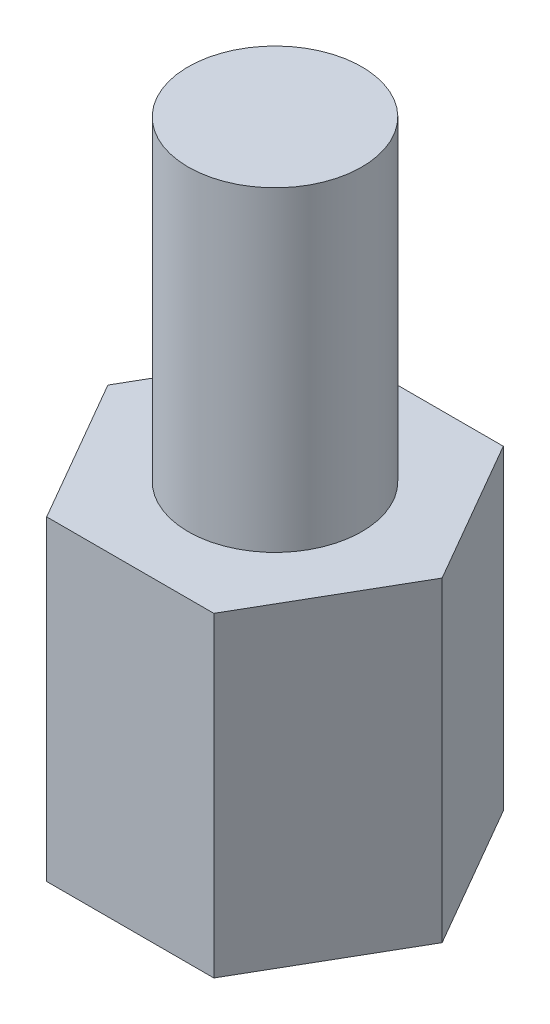
ISO-10303-21;
HEADER;
FILE_DESCRIPTION(('STEP AP214'),'2;1');
FILE_NAME('part.step','',(''),(''),'','','');
FILE_SCHEMA(('AUTOMOTIVE_DESIGN { 1 0 10303 214 1 1 1 1 }'));
ENDSEC;
DATA;
#1=APPLICATION_CONTEXT('core data for automotive mechanical design processes');
#2=APPLICATION_PROTOCOL_DEFINITION('international standard','automotive_design',2000,#1);
#3=PRODUCT_CONTEXT('',#1,'mechanical');
#4=PRODUCT('Part','Part','',(#3));
#5=PRODUCT_RELATED_PRODUCT_CATEGORY('part','',(#4));
#6=PRODUCT_DEFINITION_FORMATION('','',#4);
#7=PRODUCT_DEFINITION_CONTEXT('part definition',#1,'design');
#8=PRODUCT_DEFINITION('design','',#6,#7);
#9=PRODUCT_DEFINITION_SHAPE('','',#8);
#10=(LENGTH_UNIT() NAMED_UNIT(*) SI_UNIT(.MILLI.,.METRE.));
#11=(NAMED_UNIT(*) PLANE_ANGLE_UNIT() SI_UNIT($,.RADIAN.));
#12=(NAMED_UNIT(*) SI_UNIT($,.STERADIAN.) SOLID_ANGLE_UNIT());
#13=UNCERTAINTY_MEASURE_WITH_UNIT(LENGTH_MEASURE(1.E-05),#10,'distance_accuracy_value','');
#14=(GEOMETRIC_REPRESENTATION_CONTEXT(3) GLOBAL_UNCERTAINTY_ASSIGNED_CONTEXT((#13)) GLOBAL_UNIT_ASSIGNED_CONTEXT((#10,
#11,#12)) REPRESENTATION_CONTEXT('',''));
#15=CARTESIAN_POINT('',(0.,0.,0.));
#16=DIRECTION('',(0.,0.,1.));
#17=DIRECTION('',(1.,0.,0.));
#18=AXIS2_PLACEMENT_3D('',#15,#16,#17);
#19=CARTESIAN_POINT('',(0.,6.,0.));
#20=DIRECTION('',(0.,1.,0.));
#21=DIRECTION('',(0.,0.,1.));
#22=AXIS2_PLACEMENT_3D('',#19,#20,#21);
#23=PLANE('',#22);
#24=CARTESIAN_POINT('',(0.,6.,0.));
#25=DIRECTION('',(0.,1.,0.));
#26=DIRECTION('',(0.,0.,1.));
#27=AXIS2_PLACEMENT_3D('',#24,#25,#26);
#28=CIRCLE('',#27,1.65);
#29=CARTESIAN_POINT('',(0.,6.,1.65));
#30=VERTEX_POINT('',#29);
#31=EDGE_CURVE('E203',#30,#30,#28,.T.);
#32=ORIENTED_EDGE('',*,*,#31,.F.);
#33=EDGE_LOOP('',(#32));
#34=FACE_BOUND('',#33,.T.);
#35=DIRECTION('',(-0.5,0.,-0.866025403784439));
#36=VECTOR('',#35,1.);
#37=CARTESIAN_POINT('',(3.17542648054294,6.,0.));
#38=LINE('',#37,#36);
#39=CARTESIAN_POINT('',(3.17542648054294,6.,0.));
#40=VERTEX_POINT('',#39);
#41=CARTESIAN_POINT('',(1.58771324027147,6.,-2.75));
#42=VERTEX_POINT('',#41);
#43=EDGE_CURVE('E145',#40,#42,#38,.T.);
#44=ORIENTED_EDGE('',*,*,#43,.T.);
#45=DIRECTION('',(-1.,0.,0.));
#46=VECTOR('',#45,1.);
#47=CARTESIAN_POINT('',(1.58771324027147,6.,-2.75));
#48=LINE('',#47,#46);
#49=CARTESIAN_POINT('',(-1.58771324027147,6.,-2.75));
#50=VERTEX_POINT('',#49);
#51=EDGE_CURVE('E94',#42,#50,#48,.T.);
#52=ORIENTED_EDGE('',*,*,#51,.T.);
#53=DIRECTION('',(-0.5,0.,0.866025403784439));
#54=VECTOR('',#53,1.);
#55=CARTESIAN_POINT('',(-1.58771324027147,6.,-2.75));
#56=LINE('',#55,#54);
#57=CARTESIAN_POINT('',(-3.17542648054294,6.,0.));
#58=VERTEX_POINT('',#57);
#59=EDGE_CURVE('E106',#50,#58,#56,.T.);
#60=ORIENTED_EDGE('',*,*,#59,.T.);
#61=DIRECTION('',(0.5,0.,0.866025403784438));
#62=VECTOR('',#61,1.);
#63=CARTESIAN_POINT('',(-3.17542648054294,6.,0.));
#64=LINE('',#63,#62);
#65=CARTESIAN_POINT('',(-1.58771324027147,6.,2.75));
#66=VERTEX_POINT('',#65);
#67=EDGE_CURVE('E101',#58,#66,#64,.T.);
#68=ORIENTED_EDGE('',*,*,#67,.T.);
#69=DIRECTION('',(1.,0.,0.));
#70=VECTOR('',#69,1.);
#71=CARTESIAN_POINT('',(-1.58771324027147,6.,2.75));
#72=LINE('',#71,#70);
#73=CARTESIAN_POINT('',(1.58771324027147,6.,2.75));
#74=VERTEX_POINT('',#73);
#75=EDGE_CURVE('E104',#66,#74,#72,.T.);
#76=ORIENTED_EDGE('',*,*,#75,.T.);
#77=DIRECTION('',(0.5,0.,-0.866025403784439));
#78=VECTOR('',#77,1.);
#79=CARTESIAN_POINT('',(1.58771324027147,6.,2.75));
#80=LINE('',#79,#78);
#81=EDGE_CURVE('E57',#74,#40,#80,.T.);
#82=ORIENTED_EDGE('',*,*,#81,.T.);
#83=EDGE_LOOP('',(#44,#52,#60,#68,#76,#82));
#84=FACE_BOUND('',#83,.T.);
#85=ADVANCED_FACE('F39',(#34,#84),#23,.T.);
#86=CARTESIAN_POINT('',(0.,0.,0.));
#87=DIRECTION('',(0.,1.,0.));
#88=DIRECTION('',(0.,0.,1.));
#89=AXIS2_PLACEMENT_3D('',#86,#87,#88);
#90=PLANE('',#89);
#91=DIRECTION('',(-0.5,0.,-0.866025403784439));
#92=VECTOR('',#91,1.);
#93=CARTESIAN_POINT('',(3.17542648054294,0.,0.));
#94=LINE('',#93,#92);
#95=CARTESIAN_POINT('',(3.17542648054294,0.,0.));
#96=VERTEX_POINT('',#95);
#97=CARTESIAN_POINT('',(1.58771324027147,0.,-2.75));
#98=VERTEX_POINT('',#97);
#99=EDGE_CURVE('E128',#96,#98,#94,.T.);
#100=ORIENTED_EDGE('',*,*,#99,.F.);
#101=DIRECTION('',(0.5,0.,-0.866025403784439));
#102=VECTOR('',#101,1.);
#103=CARTESIAN_POINT('',(1.58771324027147,0.,2.75));
#104=LINE('',#103,#102);
#105=CARTESIAN_POINT('',(1.58771324027147,0.,2.75));
#106=VERTEX_POINT('',#105);
#107=EDGE_CURVE('E86',#106,#96,#104,.T.);
#108=ORIENTED_EDGE('',*,*,#107,.F.);
#109=DIRECTION('',(1.,0.,0.));
#110=VECTOR('',#109,1.);
#111=CARTESIAN_POINT('',(-1.58771324027147,0.,2.75));
#112=LINE('',#111,#110);
#113=CARTESIAN_POINT('',(-1.58771324027147,0.,2.75));
#114=VERTEX_POINT('',#113);
#115=EDGE_CURVE('E80',#114,#106,#112,.T.);
#116=ORIENTED_EDGE('',*,*,#115,.F.);
#117=DIRECTION('',(0.5,0.,0.866025403784438));
#118=VECTOR('',#117,1.);
#119=CARTESIAN_POINT('',(-3.17542648054294,0.,0.));
#120=LINE('',#119,#118);
#121=CARTESIAN_POINT('',(-3.17542648054294,0.,0.));
#122=VERTEX_POINT('',#121);
#123=EDGE_CURVE('E115',#122,#114,#120,.T.);
#124=ORIENTED_EDGE('',*,*,#123,.F.);
#125=DIRECTION('',(-0.5,0.,0.866025403784439));
#126=VECTOR('',#125,1.);
#127=CARTESIAN_POINT('',(-1.58771324027147,0.,-2.75));
#128=LINE('',#127,#126);
#129=CARTESIAN_POINT('',(-1.58771324027147,0.,-2.75));
#130=VERTEX_POINT('',#129);
#131=EDGE_CURVE('E136',#130,#122,#128,.T.);
#132=ORIENTED_EDGE('',*,*,#131,.F.);
#133=DIRECTION('',(-1.,0.,0.));
#134=VECTOR('',#133,1.);
#135=CARTESIAN_POINT('',(1.58771324027147,0.,-2.75));
#136=LINE('',#135,#134);
#137=EDGE_CURVE('E132',#98,#130,#136,.T.);
#138=ORIENTED_EDGE('',*,*,#137,.F.);
#139=EDGE_LOOP('',(#100,#108,#116,#124,#132,#138));
#140=FACE_BOUND('',#139,.T.);
#141=CARTESIAN_POINT('',(0.,0.,0.));
#142=DIRECTION('',(0.,1.,0.));
#143=DIRECTION('',(0.,0.,1.));
#144=AXIS2_PLACEMENT_3D('',#141,#142,#143);
#145=CIRCLE('',#144,1.5);
#146=CARTESIAN_POINT('',(0.,0.,1.5));
#147=VERTEX_POINT('',#146);
#148=EDGE_CURVE('E133',#147,#147,#145,.T.);
#149=ORIENTED_EDGE('',*,*,#148,.T.);
#150=EDGE_LOOP('',(#149));
#151=FACE_BOUND('',#150,.T.);
#152=ADVANCED_FACE('F158',(#140,#151),#90,.F.);
#153=CARTESIAN_POINT('',(3.17542648054294,6.,0.));
#154=DIRECTION('',(-0.866025403784438,0.,0.5));
#155=DIRECTION('',(0.5,0.,0.866025403784439));
#156=AXIS2_PLACEMENT_3D('',#153,#154,#155);
#157=PLANE('',#156);
#158=ORIENTED_EDGE('',*,*,#99,.T.);
#159=DIRECTION('',(0.,-1.,0.));
#160=VECTOR('',#159,1.);
#161=CARTESIAN_POINT('',(1.58771324027147,6.,-2.75));
#162=LINE('',#161,#160);
#163=EDGE_CURVE('E11',#42,#98,#162,.T.);
#164=ORIENTED_EDGE('',*,*,#163,.F.);
#165=ORIENTED_EDGE('',*,*,#43,.F.);
#166=DIRECTION('',(0.,-1.,0.));
#167=VECTOR('',#166,1.);
#168=CARTESIAN_POINT('',(3.17542648054294,6.,0.));
#169=LINE('',#168,#167);
#170=EDGE_CURVE('E124',#40,#96,#169,.T.);
#171=ORIENTED_EDGE('',*,*,#170,.T.);
#172=EDGE_LOOP('',(#158,#164,#165,#171));
#173=FACE_BOUND('',#172,.T.);
#174=ADVANCED_FACE('F41',(#173),#157,.F.);
#175=CARTESIAN_POINT('',(1.58771324027147,6.,-2.75));
#176=DIRECTION('',(0.,0.,1.));
#177=DIRECTION('',(1.,0.,0.));
#178=AXIS2_PLACEMENT_3D('',#175,#176,#177);
#179=PLANE('',#178);
#180=ORIENTED_EDGE('',*,*,#137,.T.);
#181=DIRECTION('',(0.,-1.,0.));
#182=VECTOR('',#181,1.);
#183=CARTESIAN_POINT('',(-1.58771324027147,6.,-2.75));
#184=LINE('',#183,#182);
#185=EDGE_CURVE('E49',#50,#130,#184,.T.);
#186=ORIENTED_EDGE('',*,*,#185,.F.);
#187=ORIENTED_EDGE('',*,*,#51,.F.);
#188=ORIENTED_EDGE('',*,*,#163,.T.);
#189=EDGE_LOOP('',(#180,#186,#187,#188));
#190=FACE_BOUND('',#189,.T.);
#191=ADVANCED_FACE('F260',(#190),#179,.F.);
#192=CARTESIAN_POINT('',(-1.58771324027147,6.,-2.75));
#193=DIRECTION('',(0.866025403784439,0.,0.5));
#194=DIRECTION('',(0.5,0.,-0.866025403784439));
#195=AXIS2_PLACEMENT_3D('',#192,#193,#194);
#196=PLANE('',#195);
#197=ORIENTED_EDGE('',*,*,#131,.T.);
#198=DIRECTION('',(0.,-1.,0.));
#199=VECTOR('',#198,1.);
#200=CARTESIAN_POINT('',(-3.17542648054294,6.,0.));
#201=LINE('',#200,#199);
#202=EDGE_CURVE('E117',#58,#122,#201,.T.);
#203=ORIENTED_EDGE('',*,*,#202,.F.);
#204=ORIENTED_EDGE('',*,*,#59,.F.);
#205=ORIENTED_EDGE('',*,*,#185,.T.);
#206=EDGE_LOOP('',(#197,#203,#204,#205));
#207=FACE_BOUND('',#206,.T.);
#208=ADVANCED_FACE('F155',(#207),#196,.F.);
#209=CARTESIAN_POINT('',(-3.17542648054294,6.,0.));
#210=DIRECTION('',(0.866025403784438,0.,-0.5));
#211=DIRECTION('',(-0.5,0.,-0.866025403784438));
#212=AXIS2_PLACEMENT_3D('',#209,#210,#211);
#213=PLANE('',#212);
#214=ORIENTED_EDGE('',*,*,#123,.T.);
#215=DIRECTION('',(0.,-1.,0.));
#216=VECTOR('',#215,1.);
#217=CARTESIAN_POINT('',(-1.58771324027147,6.,2.75));
#218=LINE('',#217,#216);
#219=EDGE_CURVE('E112',#66,#114,#218,.T.);
#220=ORIENTED_EDGE('',*,*,#219,.F.);
#221=ORIENTED_EDGE('',*,*,#67,.F.);
#222=ORIENTED_EDGE('',*,*,#202,.T.);
#223=EDGE_LOOP('',(#214,#220,#221,#222));
#224=FACE_BOUND('',#223,.T.);
#225=ADVANCED_FACE('F113',(#224),#213,.F.);
#226=CARTESIAN_POINT('',(-1.58771324027147,6.,2.75));
#227=DIRECTION('',(0.,0.,-1.));
#228=DIRECTION('',(-1.,0.,0.));
#229=AXIS2_PLACEMENT_3D('',#226,#227,#228);
#230=PLANE('',#229);
#231=ORIENTED_EDGE('',*,*,#115,.T.);
#232=DIRECTION('',(0.,-1.,0.));
#233=VECTOR('',#232,1.);
#234=CARTESIAN_POINT('',(1.58771324027147,6.,2.75));
#235=LINE('',#234,#233);
#236=EDGE_CURVE('E118',#74,#106,#235,.T.);
#237=ORIENTED_EDGE('',*,*,#236,.F.);
#238=ORIENTED_EDGE('',*,*,#75,.F.);
#239=ORIENTED_EDGE('',*,*,#219,.T.);
#240=EDGE_LOOP('',(#231,#237,#238,#239));
#241=FACE_BOUND('',#240,.T.);
#242=ADVANCED_FACE('F120',(#241),#230,.F.);
#243=CARTESIAN_POINT('',(1.58771324027147,6.,2.75));
#244=DIRECTION('',(-0.866025403784439,0.,-0.5));
#245=DIRECTION('',(-0.5,0.,0.866025403784439));
#246=AXIS2_PLACEMENT_3D('',#243,#244,#245);
#247=PLANE('',#246);
#248=ORIENTED_EDGE('',*,*,#107,.T.);
#249=ORIENTED_EDGE('',*,*,#170,.F.);
#250=ORIENTED_EDGE('',*,*,#81,.F.);
#251=ORIENTED_EDGE('',*,*,#236,.T.);
#252=EDGE_LOOP('',(#248,#249,#250,#251));
#253=FACE_BOUND('',#252,.T.);
#254=ADVANCED_FACE('F163',(#253),#247,.F.);
#255=CARTESIAN_POINT('',(0.,6.,0.));
#256=DIRECTION('',(0.,-1.,0.));
#257=DIRECTION('',(0.,0.,-1.));
#258=AXIS2_PLACEMENT_3D('',#255,#256,#257);
#259=CYLINDRICAL_SURFACE('',#258,1.5);
#260=CARTESIAN_POINT('',(0.,6.,0.));
#261=DIRECTION('',(0.,1.,0.));
#262=DIRECTION('',(0.,0.,1.));
#263=AXIS2_PLACEMENT_3D('',#260,#261,#262);
#264=CIRCLE('',#263,1.5);
#265=CARTESIAN_POINT('',(0.,6.,1.5));
#266=VERTEX_POINT('',#265);
#267=EDGE_CURVE('E202',#266,#266,#264,.T.);
#268=ORIENTED_EDGE('',*,*,#267,.T.);
#269=EDGE_LOOP('',(#268));
#270=FACE_BOUND('',#269,.T.);
#271=ORIENTED_EDGE('',*,*,#148,.F.);
#272=EDGE_LOOP('',(#271));
#273=FACE_BOUND('',#272,.T.);
#274=ADVANCED_FACE('F165',(#270,#273),#259,.F.);
#275=CARTESIAN_POINT('',(0.,6.,0.));
#276=DIRECTION('',(0.,1.,0.));
#277=DIRECTION('',(0.,0.,1.));
#278=AXIS2_PLACEMENT_3D('',#275,#276,#277);
#279=PLANE('',#278);
#280=ORIENTED_EDGE('',*,*,#267,.F.);
#281=EDGE_LOOP('',(#280));
#282=FACE_BOUND('',#281,.T.);
#283=ADVANCED_FACE('F171',(#282),#279,.F.);
#284=CARTESIAN_POINT('',(0.,12.,0.));
#285=DIRECTION('',(0.,-1.,0.));
#286=DIRECTION('',(0.,0.,-1.));
#287=AXIS2_PLACEMENT_3D('',#284,#285,#286);
#288=CYLINDRICAL_SURFACE('',#287,1.65);
#289=CARTESIAN_POINT('',(0.,12.,0.));
#290=DIRECTION('',(0.,1.,0.));
#291=DIRECTION('',(0.,0.,1.));
#292=AXIS2_PLACEMENT_3D('',#289,#290,#291);
#293=CIRCLE('',#292,1.65);
#294=CARTESIAN_POINT('',(0.,12.,1.65));
#295=VERTEX_POINT('',#294);
#296=EDGE_CURVE('E200',#295,#295,#293,.T.);
#297=ORIENTED_EDGE('',*,*,#296,.F.);
#298=EDGE_LOOP('',(#297));
#299=FACE_BOUND('',#298,.T.);
#300=ORIENTED_EDGE('',*,*,#31,.T.);
#301=EDGE_LOOP('',(#300));
#302=FACE_BOUND('',#301,.T.);
#303=ADVANCED_FACE('F186',(#299,#302),#288,.T.);
#304=CARTESIAN_POINT('',(0.,12.,0.));
#305=DIRECTION('',(0.,1.,0.));
#306=DIRECTION('',(0.,0.,1.));
#307=AXIS2_PLACEMENT_3D('',#304,#305,#306);
#308=PLANE('',#307);
#309=ORIENTED_EDGE('',*,*,#296,.T.);
#310=EDGE_LOOP('',(#309));
#311=FACE_BOUND('',#310,.T.);
#312=ADVANCED_FACE('F189',(#311),#308,.T.);
#313=CLOSED_SHELL('',(#85,#152,#174,#191,#208,#225,#242,#254,#274,#283,#303,#312));
#314=MANIFOLD_SOLID_BREP('B2',#313);
#315=ADVANCED_BREP_SHAPE_REPRESENTATION('',(#18,#314),#14);
#316=SHAPE_DEFINITION_REPRESENTATION(#9,#315);
ENDSEC;
END-ISO-10303-21;
